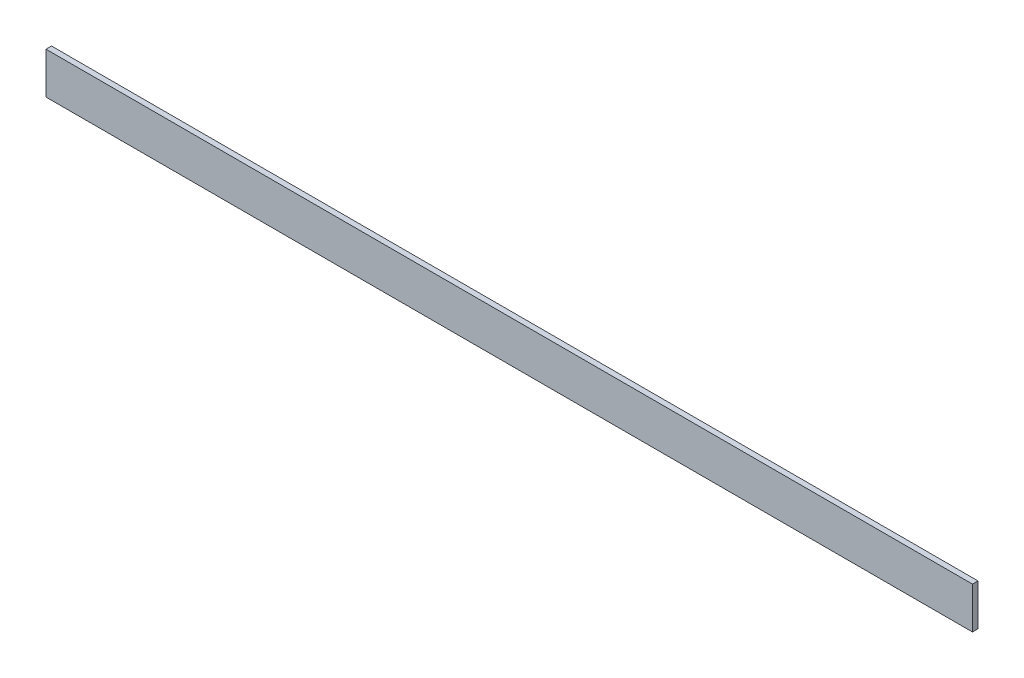
ISO-10303-21;
HEADER;
FILE_DESCRIPTION(('STEP AP214'),'2;1');
FILE_NAME('part.step','',(''),(''),'','','');
FILE_SCHEMA(('AUTOMOTIVE_DESIGN { 1 0 10303 214 1 1 1 1 }'));
ENDSEC;
DATA;
#1=APPLICATION_CONTEXT('core data for automotive mechanical design processes');
#2=APPLICATION_PROTOCOL_DEFINITION('international standard','automotive_design',2000,#1);
#3=PRODUCT_CONTEXT('',#1,'mechanical');
#4=PRODUCT('Part','Part','',(#3));
#5=PRODUCT_RELATED_PRODUCT_CATEGORY('part','',(#4));
#6=PRODUCT_DEFINITION_FORMATION('','',#4);
#7=PRODUCT_DEFINITION_CONTEXT('part definition',#1,'design');
#8=PRODUCT_DEFINITION('design','',#6,#7);
#9=PRODUCT_DEFINITION_SHAPE('','',#8);
#10=(LENGTH_UNIT() NAMED_UNIT(*) SI_UNIT(.MILLI.,.METRE.));
#11=(NAMED_UNIT(*) PLANE_ANGLE_UNIT() SI_UNIT($,.RADIAN.));
#12=(NAMED_UNIT(*) SI_UNIT($,.STERADIAN.) SOLID_ANGLE_UNIT());
#13=UNCERTAINTY_MEASURE_WITH_UNIT(LENGTH_MEASURE(1.E-05),#10,'distance_accuracy_value','');
#14=(GEOMETRIC_REPRESENTATION_CONTEXT(3) GLOBAL_UNCERTAINTY_ASSIGNED_CONTEXT((#13)) GLOBAL_UNIT_ASSIGNED_CONTEXT((#10,
#11,#12)) REPRESENTATION_CONTEXT('',''));
#15=CARTESIAN_POINT('',(0.,0.,0.));
#16=DIRECTION('',(0.,0.,1.));
#17=DIRECTION('',(1.,0.,0.));
#18=AXIS2_PLACEMENT_3D('',#15,#16,#17);
#19=CARTESIAN_POINT('',(335.,-15.,4.));
#20=DIRECTION('',(-1.,0.,0.));
#21=DIRECTION('',(0.,0.,1.));
#22=AXIS2_PLACEMENT_3D('',#19,#20,#21);
#23=PLANE('',#22);
#24=DIRECTION('',(0.,1.,0.));
#25=VECTOR('',#24,1.);
#26=CARTESIAN_POINT('',(335.,-15.,0.));
#27=LINE('',#26,#25);
#28=CARTESIAN_POINT('',(335.,-15.,0.));
#29=VERTEX_POINT('',#28);
#30=CARTESIAN_POINT('',(335.,15.,0.));
#31=VERTEX_POINT('',#30);
#32=EDGE_CURVE('E97',#29,#31,#27,.T.);
#33=ORIENTED_EDGE('',*,*,#32,.T.);
#34=DIRECTION('',(0.,0.,-1.));
#35=VECTOR('',#34,1.);
#36=CARTESIAN_POINT('',(335.,15.,4.));
#37=LINE('',#36,#35);
#38=CARTESIAN_POINT('',(335.,15.,4.));
#39=VERTEX_POINT('',#38);
#40=EDGE_CURVE('E11',#39,#31,#37,.T.);
#41=ORIENTED_EDGE('',*,*,#40,.F.);
#42=DIRECTION('',(0.,1.,0.));
#43=VECTOR('',#42,1.);
#44=CARTESIAN_POINT('',(335.,-15.,4.));
#45=LINE('',#44,#43);
#46=CARTESIAN_POINT('',(335.,-15.,4.));
#47=VERTEX_POINT('',#46);
#48=EDGE_CURVE('E85',#47,#39,#45,.T.);
#49=ORIENTED_EDGE('',*,*,#48,.F.);
#50=DIRECTION('',(0.,0.,-1.));
#51=VECTOR('',#50,1.);
#52=CARTESIAN_POINT('',(335.,-15.,4.));
#53=LINE('',#52,#51);
#54=EDGE_CURVE('E93',#47,#29,#53,.T.);
#55=ORIENTED_EDGE('',*,*,#54,.T.);
#56=EDGE_LOOP('',(#33,#41,#49,#55));
#57=FACE_BOUND('',#56,.T.);
#58=ADVANCED_FACE('F34',(#57),#23,.F.);
#59=CARTESIAN_POINT('',(-335.,15.,4.));
#60=DIRECTION('',(0.,-1.,0.));
#61=DIRECTION('',(0.,0.,-1.));
#62=AXIS2_PLACEMENT_3D('',#59,#60,#61);
#63=PLANE('',#62);
#64=DIRECTION('',(-1.,0.,0.));
#65=VECTOR('',#64,1.);
#66=CARTESIAN_POINT('',(-335.,15.,0.));
#67=LINE('',#66,#65);
#68=CARTESIAN_POINT('',(-335.,15.,0.));
#69=VERTEX_POINT('',#68);
#70=EDGE_CURVE('E89',#31,#69,#67,.T.);
#71=ORIENTED_EDGE('',*,*,#70,.T.);
#72=DIRECTION('',(0.,0.,-1.));
#73=VECTOR('',#72,1.);
#74=CARTESIAN_POINT('',(-335.,15.,4.));
#75=LINE('',#74,#73);
#76=CARTESIAN_POINT('',(-335.,15.,4.));
#77=VERTEX_POINT('',#76);
#78=EDGE_CURVE('E42',#77,#69,#75,.T.);
#79=ORIENTED_EDGE('',*,*,#78,.F.);
#80=DIRECTION('',(-1.,0.,0.));
#81=VECTOR('',#80,1.);
#82=CARTESIAN_POINT('',(-335.,15.,4.));
#83=LINE('',#82,#81);
#84=EDGE_CURVE('E80',#39,#77,#83,.T.);
#85=ORIENTED_EDGE('',*,*,#84,.F.);
#86=ORIENTED_EDGE('',*,*,#40,.T.);
#87=EDGE_LOOP('',(#71,#79,#85,#86));
#88=FACE_BOUND('',#87,.T.);
#89=ADVANCED_FACE('F88',(#88),#63,.F.);
#90=CARTESIAN_POINT('',(-335.,-15.,4.));
#91=DIRECTION('',(1.,0.,0.));
#92=DIRECTION('',(0.,0.,-1.));
#93=AXIS2_PLACEMENT_3D('',#90,#91,#92);
#94=PLANE('',#93);
#95=DIRECTION('',(0.,-1.,0.));
#96=VECTOR('',#95,1.);
#97=CARTESIAN_POINT('',(-335.,-15.,0.));
#98=LINE('',#97,#96);
#99=CARTESIAN_POINT('',(-335.,-15.,0.));
#100=VERTEX_POINT('',#99);
#101=EDGE_CURVE('E67',#69,#100,#98,.T.);
#102=ORIENTED_EDGE('',*,*,#101,.T.);
#103=DIRECTION('',(0.,0.,-1.));
#104=VECTOR('',#103,1.);
#105=CARTESIAN_POINT('',(-335.,-15.,4.));
#106=LINE('',#105,#104);
#107=CARTESIAN_POINT('',(-335.,-15.,4.));
#108=VERTEX_POINT('',#107);
#109=EDGE_CURVE('E90',#108,#100,#106,.T.);
#110=ORIENTED_EDGE('',*,*,#109,.F.);
#111=DIRECTION('',(0.,-1.,0.));
#112=VECTOR('',#111,1.);
#113=CARTESIAN_POINT('',(-335.,-15.,4.));
#114=LINE('',#113,#112);
#115=EDGE_CURVE('E83',#77,#108,#114,.T.);
#116=ORIENTED_EDGE('',*,*,#115,.F.);
#117=ORIENTED_EDGE('',*,*,#78,.T.);
#118=EDGE_LOOP('',(#102,#110,#116,#117));
#119=FACE_BOUND('',#118,.T.);
#120=ADVANCED_FACE('F91',(#119),#94,.F.);
#121=CARTESIAN_POINT('',(-335.,-15.,4.));
#122=DIRECTION('',(0.,1.,0.));
#123=DIRECTION('',(0.,0.,1.));
#124=AXIS2_PLACEMENT_3D('',#121,#122,#123);
#125=PLANE('',#124);
#126=DIRECTION('',(1.,0.,0.));
#127=VECTOR('',#126,1.);
#128=CARTESIAN_POINT('',(-335.,-15.,0.));
#129=LINE('',#128,#127);
#130=EDGE_CURVE('E73',#100,#29,#129,.T.);
#131=ORIENTED_EDGE('',*,*,#130,.T.);
#132=ORIENTED_EDGE('',*,*,#54,.F.);
#133=DIRECTION('',(1.,0.,0.));
#134=VECTOR('',#133,1.);
#135=CARTESIAN_POINT('',(-335.,-15.,4.));
#136=LINE('',#135,#134);
#137=EDGE_CURVE('E50',#108,#47,#136,.T.);
#138=ORIENTED_EDGE('',*,*,#137,.F.);
#139=ORIENTED_EDGE('',*,*,#109,.T.);
#140=EDGE_LOOP('',(#131,#132,#138,#139));
#141=FACE_BOUND('',#140,.T.);
#142=ADVANCED_FACE('F104',(#141),#125,.F.);
#143=CARTESIAN_POINT('',(0.,0.,4.));
#144=DIRECTION('',(0.,0.,-1.));
#145=DIRECTION('',(-1.,0.,0.));
#146=AXIS2_PLACEMENT_3D('',#143,#144,#145);
#147=PLANE('',#146);
#148=ORIENTED_EDGE('',*,*,#48,.T.);
#149=ORIENTED_EDGE('',*,*,#84,.T.);
#150=ORIENTED_EDGE('',*,*,#115,.T.);
#151=ORIENTED_EDGE('',*,*,#137,.T.);
#152=EDGE_LOOP('',(#148,#149,#150,#151));
#153=FACE_BOUND('',#152,.T.);
#154=ADVANCED_FACE('F81',(#153),#147,.F.);
#155=CARTESIAN_POINT('',(0.,0.,0.));
#156=DIRECTION('',(0.,0.,-1.));
#157=DIRECTION('',(-1.,0.,0.));
#158=AXIS2_PLACEMENT_3D('',#155,#156,#157);
#159=PLANE('',#158);
#160=ORIENTED_EDGE('',*,*,#32,.F.);
#161=ORIENTED_EDGE('',*,*,#130,.F.);
#162=ORIENTED_EDGE('',*,*,#101,.F.);
#163=ORIENTED_EDGE('',*,*,#70,.F.);
#164=EDGE_LOOP('',(#160,#161,#162,#163));
#165=FACE_BOUND('',#164,.T.);
#166=ADVANCED_FACE('F107',(#165),#159,.T.);
#167=CLOSED_SHELL('',(#58,#89,#120,#142,#154,#166));
#168=MANIFOLD_SOLID_BREP('B2',#167);
#169=ADVANCED_BREP_SHAPE_REPRESENTATION('',(#18,#168),#14);
#170=SHAPE_DEFINITION_REPRESENTATION(#9,#169);
ENDSEC;
END-ISO-10303-21;
